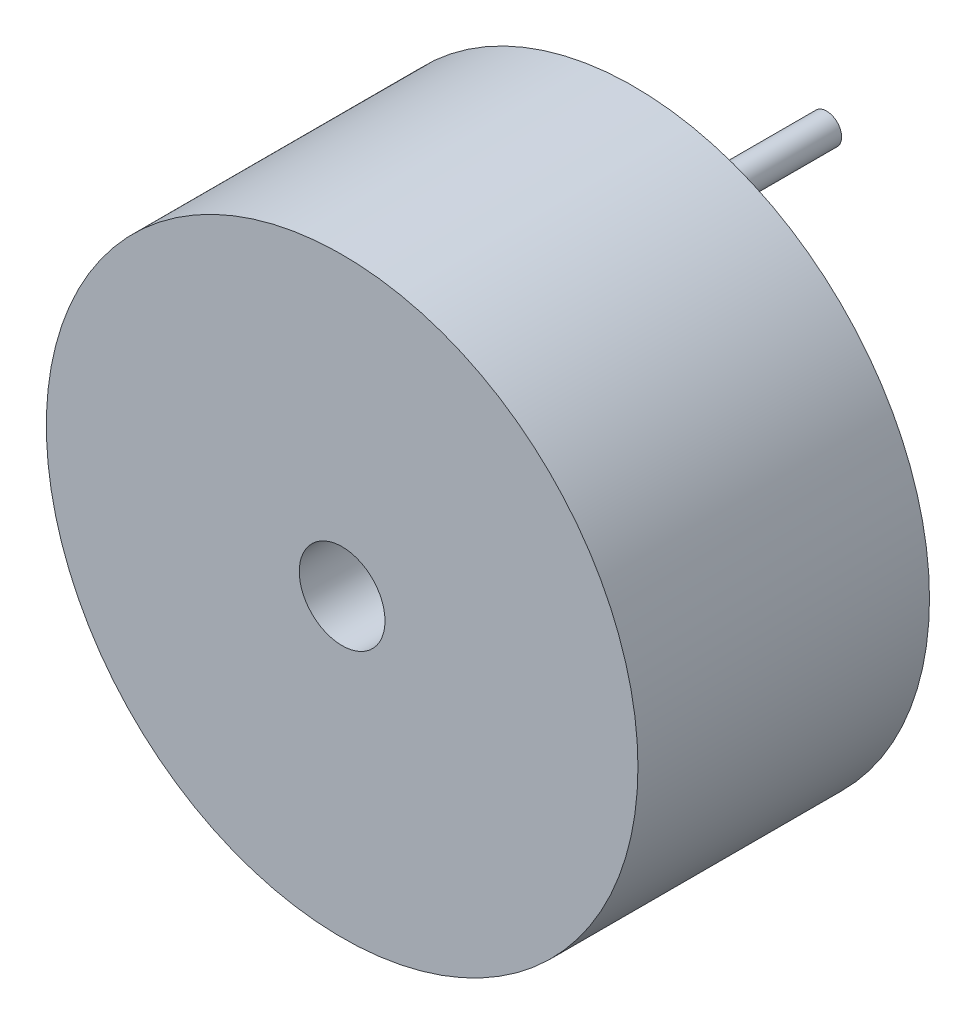
ISO-10303-21;
HEADER;
FILE_DESCRIPTION(('STEP AP214'),'2;1');
FILE_NAME('part.step','',(''),(''),'','','');
FILE_SCHEMA(('AUTOMOTIVE_DESIGN { 1 0 10303 214 1 1 1 1 }'));
ENDSEC;
DATA;
#1=APPLICATION_CONTEXT('core data for automotive mechanical design processes');
#2=APPLICATION_PROTOCOL_DEFINITION('international standard','automotive_design',2000,#1);
#3=PRODUCT_CONTEXT('',#1,'mechanical');
#4=PRODUCT('Part','Part','',(#3));
#5=PRODUCT_RELATED_PRODUCT_CATEGORY('part','',(#4));
#6=PRODUCT_DEFINITION_FORMATION('','',#4);
#7=PRODUCT_DEFINITION_CONTEXT('part definition',#1,'design');
#8=PRODUCT_DEFINITION('design','',#6,#7);
#9=PRODUCT_DEFINITION_SHAPE('','',#8);
#10=(LENGTH_UNIT() NAMED_UNIT(*) SI_UNIT(.MILLI.,.METRE.));
#11=(NAMED_UNIT(*) PLANE_ANGLE_UNIT() SI_UNIT($,.RADIAN.));
#12=(NAMED_UNIT(*) SI_UNIT($,.STERADIAN.) SOLID_ANGLE_UNIT());
#13=UNCERTAINTY_MEASURE_WITH_UNIT(LENGTH_MEASURE(1.E-05),#10,'distance_accuracy_value','');
#14=(GEOMETRIC_REPRESENTATION_CONTEXT(3) GLOBAL_UNCERTAINTY_ASSIGNED_CONTEXT((#13)) GLOBAL_UNIT_ASSIGNED_CONTEXT((#10,
#11,#12)) REPRESENTATION_CONTEXT('',''));
#15=CARTESIAN_POINT('',(0.,0.,0.));
#16=DIRECTION('',(0.,0.,1.));
#17=DIRECTION('',(1.,0.,0.));
#18=AXIS2_PLACEMENT_3D('',#15,#16,#17);
#19=CARTESIAN_POINT('',(0.,0.,6.8));
#20=DIRECTION('',(0.,0.,-1.));
#21=DIRECTION('',(-1.,0.,0.));
#22=AXIS2_PLACEMENT_3D('',#19,#20,#21);
#23=CYLINDRICAL_SURFACE('',#22,6.9);
#24=CARTESIAN_POINT('',(0.,0.,6.8));
#25=DIRECTION('',(0.,0.,1.));
#26=DIRECTION('',(1.,0.,0.));
#27=AXIS2_PLACEMENT_3D('',#24,#25,#26);
#28=CIRCLE('',#27,6.9);
#29=CARTESIAN_POINT('',(6.9,0.,6.8));
#30=VERTEX_POINT('',#29);
#31=EDGE_CURVE('E43',#30,#30,#28,.T.);
#32=ORIENTED_EDGE('',*,*,#31,.F.);
#33=EDGE_LOOP('',(#32));
#34=FACE_BOUND('',#33,.T.);
#35=CARTESIAN_POINT('',(0.,0.,0.));
#36=DIRECTION('',(0.,0.,1.));
#37=DIRECTION('',(1.,0.,0.));
#38=AXIS2_PLACEMENT_3D('',#35,#36,#37);
#39=CIRCLE('',#38,6.9);
#40=CARTESIAN_POINT('',(6.9,0.,0.));
#41=VERTEX_POINT('',#40);
#42=EDGE_CURVE('E47',#41,#41,#39,.T.);
#43=ORIENTED_EDGE('',*,*,#42,.T.);
#44=EDGE_LOOP('',(#43));
#45=FACE_BOUND('',#44,.T.);
#46=ADVANCED_FACE('F33',(#34,#45),#23,.T.);
#47=CARTESIAN_POINT('',(0.,0.,6.8));
#48=DIRECTION('',(0.,0.,1.));
#49=DIRECTION('',(1.,0.,0.));
#50=AXIS2_PLACEMENT_3D('',#47,#48,#49);
#51=PLANE('',#50);
#52=CARTESIAN_POINT('',(0.,0.,6.8));
#53=DIRECTION('',(0.,0.,1.));
#54=DIRECTION('',(1.,0.,0.));
#55=AXIS2_PLACEMENT_3D('',#52,#53,#54);
#56=CIRCLE('',#55,1.);
#57=CARTESIAN_POINT('',(1.,0.,6.8));
#58=VERTEX_POINT('',#57);
#59=EDGE_CURVE('E53',#58,#58,#56,.T.);
#60=ORIENTED_EDGE('',*,*,#59,.F.);
#61=EDGE_LOOP('',(#60));
#62=FACE_BOUND('',#61,.T.);
#63=ORIENTED_EDGE('',*,*,#31,.T.);
#64=EDGE_LOOP('',(#63));
#65=FACE_BOUND('',#64,.T.);
#66=ADVANCED_FACE('F80',(#62,#65),#51,.T.);
#67=CARTESIAN_POINT('',(0.,0.,0.));
#68=DIRECTION('',(0.,0.,1.));
#69=DIRECTION('',(1.,0.,0.));
#70=AXIS2_PLACEMENT_3D('',#67,#68,#69);
#71=PLANE('',#70);
#72=CARTESIAN_POINT('',(0.,-3.8,0.));
#73=DIRECTION('',(0.,0.,1.));
#74=DIRECTION('',(1.,0.,0.));
#75=AXIS2_PLACEMENT_3D('',#72,#73,#74);
#76=CIRCLE('',#75,0.35);
#77=CARTESIAN_POINT('',(0.35,-3.8,0.));
#78=VERTEX_POINT('',#77);
#79=EDGE_CURVE('E10',#78,#78,#76,.F.);
#80=ORIENTED_EDGE('',*,*,#79,.F.);
#81=EDGE_LOOP('',(#80));
#82=FACE_BOUND('',#81,.T.);
#83=CARTESIAN_POINT('',(0.,3.8,0.));
#84=DIRECTION('',(0.,0.,1.));
#85=DIRECTION('',(1.,0.,0.));
#86=AXIS2_PLACEMENT_3D('',#83,#84,#85);
#87=CIRCLE('',#86,0.35);
#88=CARTESIAN_POINT('',(0.35,3.8,0.));
#89=VERTEX_POINT('',#88);
#90=EDGE_CURVE('E39',#89,#89,#87,.F.);
#91=ORIENTED_EDGE('',*,*,#90,.F.);
#92=EDGE_LOOP('',(#91));
#93=FACE_BOUND('',#92,.T.);
#94=ORIENTED_EDGE('',*,*,#42,.F.);
#95=EDGE_LOOP('',(#94));
#96=FACE_BOUND('',#95,.T.);
#97=ADVANCED_FACE('F85',(#82,#93,#96),#71,.F.);
#98=CARTESIAN_POINT('',(0.,0.,4.8));
#99=DIRECTION('',(0.,0.,1.));
#100=DIRECTION('',(1.,0.,0.));
#101=AXIS2_PLACEMENT_3D('',#98,#99,#100);
#102=CYLINDRICAL_SURFACE('',#101,1.);
#103=CARTESIAN_POINT('',(0.,0.,4.8));
#104=DIRECTION('',(0.,0.,1.));
#105=DIRECTION('',(1.,0.,0.));
#106=AXIS2_PLACEMENT_3D('',#103,#104,#105);
#107=CIRCLE('',#106,1.);
#108=CARTESIAN_POINT('',(1.,0.,4.8));
#109=VERTEX_POINT('',#108);
#110=EDGE_CURVE('E51',#109,#109,#107,.T.);
#111=ORIENTED_EDGE('',*,*,#110,.F.);
#112=EDGE_LOOP('',(#111));
#113=FACE_BOUND('',#112,.T.);
#114=ORIENTED_EDGE('',*,*,#59,.T.);
#115=EDGE_LOOP('',(#114));
#116=FACE_BOUND('',#115,.T.);
#117=ADVANCED_FACE('F93',(#113,#116),#102,.F.);
#118=CARTESIAN_POINT('',(0.,0.,4.8));
#119=DIRECTION('',(0.,0.,1.));
#120=DIRECTION('',(1.,0.,0.));
#121=AXIS2_PLACEMENT_3D('',#118,#119,#120);
#122=PLANE('',#121);
#123=ORIENTED_EDGE('',*,*,#110,.T.);
#124=EDGE_LOOP('',(#123));
#125=FACE_BOUND('',#124,.T.);
#126=ADVANCED_FACE('F98',(#125),#122,.T.);
#127=CARTESIAN_POINT('',(0.,3.8,-4.5));
#128=DIRECTION('',(0.,0.,1.));
#129=DIRECTION('',(1.,0.,0.));
#130=AXIS2_PLACEMENT_3D('',#127,#128,#129);
#131=CYLINDRICAL_SURFACE('',#130,0.35);
#132=CARTESIAN_POINT('',(0.,3.8,-4.5));
#133=DIRECTION('',(0.,0.,-1.));
#134=DIRECTION('',(-1.,0.,0.));
#135=AXIS2_PLACEMENT_3D('',#132,#133,#134);
#136=CIRCLE('',#135,0.35);
#137=CARTESIAN_POINT('',(-0.35,3.8,-4.5));
#138=VERTEX_POINT('',#137);
#139=EDGE_CURVE('E56',#138,#138,#136,.T.);
#140=ORIENTED_EDGE('',*,*,#139,.F.);
#141=EDGE_LOOP('',(#140));
#142=FACE_BOUND('',#141,.T.);
#143=ORIENTED_EDGE('',*,*,#90,.T.);
#144=EDGE_LOOP('',(#143));
#145=FACE_BOUND('',#144,.T.);
#146=ADVANCED_FACE('F76',(#142,#145),#131,.T.);
#147=CARTESIAN_POINT('',(0.,3.8,-4.5));
#148=DIRECTION('',(0.,0.,-1.));
#149=DIRECTION('',(-1.,0.,0.));
#150=AXIS2_PLACEMENT_3D('',#147,#148,#149);
#151=PLANE('',#150);
#152=ORIENTED_EDGE('',*,*,#139,.T.);
#153=EDGE_LOOP('',(#152));
#154=FACE_BOUND('',#153,.T.);
#155=ADVANCED_FACE('F69',(#154),#151,.T.);
#156=CARTESIAN_POINT('',(0.,-3.8,-4.5));
#157=DIRECTION('',(0.,0.,1.));
#158=DIRECTION('',(1.,0.,0.));
#159=AXIS2_PLACEMENT_3D('',#156,#157,#158);
#160=CYLINDRICAL_SURFACE('',#159,0.35);
#161=CARTESIAN_POINT('',(0.,-3.8,-4.5));
#162=DIRECTION('',(0.,0.,-1.));
#163=DIRECTION('',(-1.,0.,0.));
#164=AXIS2_PLACEMENT_3D('',#161,#162,#163);
#165=CIRCLE('',#164,0.35);
#166=CARTESIAN_POINT('',(-0.35,-3.8,-4.5));
#167=VERTEX_POINT('',#166);
#168=EDGE_CURVE('E61',#167,#167,#165,.T.);
#169=ORIENTED_EDGE('',*,*,#168,.F.);
#170=EDGE_LOOP('',(#169));
#171=FACE_BOUND('',#170,.T.);
#172=ORIENTED_EDGE('',*,*,#79,.T.);
#173=EDGE_LOOP('',(#172));
#174=FACE_BOUND('',#173,.T.);
#175=ADVANCED_FACE('F67',(#171,#174),#160,.T.);
#176=CARTESIAN_POINT('',(0.,-3.8,-4.5));
#177=DIRECTION('',(0.,0.,-1.));
#178=DIRECTION('',(-1.,0.,0.));
#179=AXIS2_PLACEMENT_3D('',#176,#177,#178);
#180=PLANE('',#179);
#181=ORIENTED_EDGE('',*,*,#168,.T.);
#182=EDGE_LOOP('',(#181));
#183=FACE_BOUND('',#182,.T.);
#184=ADVANCED_FACE('F65',(#183),#180,.T.);
#185=CLOSED_SHELL('',(#46,#66,#97,#117,#126,#146,#155,#175,#184));
#186=MANIFOLD_SOLID_BREP('B2',#185);
#187=ADVANCED_BREP_SHAPE_REPRESENTATION('',(#18,#186),#14);
#188=SHAPE_DEFINITION_REPRESENTATION(#9,#187);
ENDSEC;
END-ISO-10303-21;
